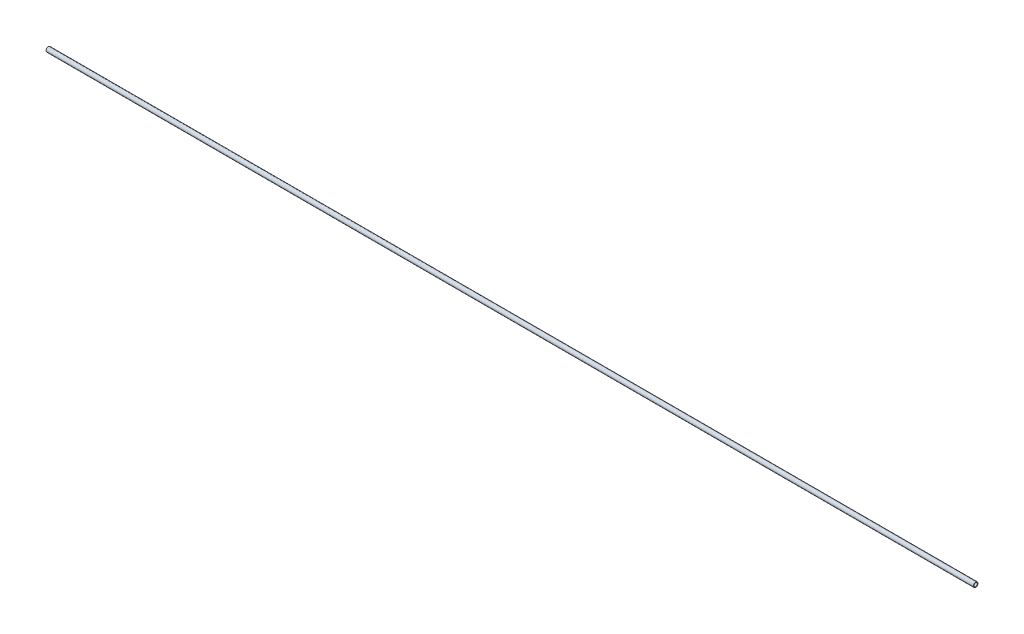
ISO-10303-21;
HEADER;
FILE_DESCRIPTION(('STEP AP214'),'2;1');
FILE_NAME('part.step','',(''),(''),'','','');
FILE_SCHEMA(('AUTOMOTIVE_DESIGN { 1 0 10303 214 1 1 1 1 }'));
ENDSEC;
DATA;
#1=APPLICATION_CONTEXT('core data for automotive mechanical design processes');
#2=APPLICATION_PROTOCOL_DEFINITION('international standard','automotive_design',2000,#1);
#3=PRODUCT_CONTEXT('',#1,'mechanical');
#4=PRODUCT('Part','Part','',(#3));
#5=PRODUCT_RELATED_PRODUCT_CATEGORY('part','',(#4));
#6=PRODUCT_DEFINITION_FORMATION('','',#4);
#7=PRODUCT_DEFINITION_CONTEXT('part definition',#1,'design');
#8=PRODUCT_DEFINITION('design','',#6,#7);
#9=PRODUCT_DEFINITION_SHAPE('','',#8);
#10=(LENGTH_UNIT() NAMED_UNIT(*) SI_UNIT(.MILLI.,.METRE.));
#11=(NAMED_UNIT(*) PLANE_ANGLE_UNIT() SI_UNIT($,.RADIAN.));
#12=(NAMED_UNIT(*) SI_UNIT($,.STERADIAN.) SOLID_ANGLE_UNIT());
#13=UNCERTAINTY_MEASURE_WITH_UNIT(LENGTH_MEASURE(1.E-05),#10,'distance_accuracy_value','');
#14=(GEOMETRIC_REPRESENTATION_CONTEXT(3) GLOBAL_UNCERTAINTY_ASSIGNED_CONTEXT((#13)) GLOBAL_UNIT_ASSIGNED_CONTEXT((#10,
#11,#12)) REPRESENTATION_CONTEXT('',''));
#15=CARTESIAN_POINT('',(0.,0.,0.));
#16=DIRECTION('',(0.,0.,1.));
#17=DIRECTION('',(1.,0.,0.));
#18=AXIS2_PLACEMENT_3D('',#15,#16,#17);
#19=CARTESIAN_POINT('',(5080.,0.,0.));
#20=DIRECTION('',(1.,0.,0.));
#21=DIRECTION('',(0.,0.,-1.));
#22=AXIS2_PLACEMENT_3D('',#19,#20,#21);
#23=PLANE('',#22);
#24=CARTESIAN_POINT('',(5080.,0.,0.));
#25=DIRECTION('',(1.,0.,0.));
#26=DIRECTION('',(0.,0.,-1.));
#27=AXIS2_PLACEMENT_3D('',#24,#25,#26);
#28=CIRCLE('',#27,12.7);
#29=CARTESIAN_POINT('',(5080.,0.,12.7));
#30=VERTEX_POINT('',#29);
#31=EDGE_CURVE('E10',#30,#30,#28,.T.);
#32=ORIENTED_EDGE('',*,*,#31,.T.);
#33=EDGE_LOOP('',(#32));
#34=FACE_BOUND('',#33,.T.);
#35=CARTESIAN_POINT('',(5080.,0.,0.));
#36=DIRECTION('',(1.,0.,0.));
#37=DIRECTION('',(0.,0.,-1.));
#38=AXIS2_PLACEMENT_3D('',#35,#36,#37);
#39=CIRCLE('',#38,9.652);
#40=CARTESIAN_POINT('',(5080.,0.,9.652));
#41=VERTEX_POINT('',#40);
#42=EDGE_CURVE('E45',#41,#41,#39,.T.);
#43=ORIENTED_EDGE('',*,*,#42,.F.);
#44=EDGE_LOOP('',(#43));
#45=FACE_BOUND('',#44,.T.);
#46=ADVANCED_FACE('F34',(#34,#45),#23,.T.);
#47=CARTESIAN_POINT('',(0.,0.,0.));
#48=DIRECTION('',(1.,0.,0.));
#49=DIRECTION('',(0.,0.,-1.));
#50=AXIS2_PLACEMENT_3D('',#47,#48,#49);
#51=PLANE('',#50);
#52=CARTESIAN_POINT('',(0.,0.,0.));
#53=DIRECTION('',(1.,0.,0.));
#54=DIRECTION('',(0.,0.,-1.));
#55=AXIS2_PLACEMENT_3D('',#52,#53,#54);
#56=CIRCLE('',#55,12.7);
#57=CARTESIAN_POINT('',(-8.88178419700125E-13,0.,12.7));
#58=VERTEX_POINT('',#57);
#59=EDGE_CURVE('E38',#58,#58,#56,.T.);
#60=ORIENTED_EDGE('',*,*,#59,.F.);
#61=EDGE_LOOP('',(#60));
#62=FACE_BOUND('',#61,.T.);
#63=CARTESIAN_POINT('',(0.,0.,0.));
#64=DIRECTION('',(1.,0.,0.));
#65=DIRECTION('',(0.,0.,-1.));
#66=AXIS2_PLACEMENT_3D('',#63,#64,#65);
#67=CIRCLE('',#66,9.652);
#68=CARTESIAN_POINT('',(-8.88178419700125E-13,0.,9.652));
#69=VERTEX_POINT('',#68);
#70=EDGE_CURVE('E47',#69,#69,#67,.T.);
#71=ORIENTED_EDGE('',*,*,#70,.T.);
#72=EDGE_LOOP('',(#71));
#73=FACE_BOUND('',#72,.T.);
#74=ADVANCED_FACE('F57',(#62,#73),#51,.F.);
#75=CARTESIAN_POINT('',(5080.,0.,0.));
#76=DIRECTION('',(-1.,0.,0.));
#77=DIRECTION('',(0.,0.,1.));
#78=AXIS2_PLACEMENT_3D('',#75,#76,#77);
#79=CYLINDRICAL_SURFACE('',#78,12.7);
#80=CARTESIAN_POINT('',(5080.,0.,12.7));
#81=CARTESIAN_POINT('',(5027.08333333333,0.,12.7));
#82=CARTESIAN_POINT('',(4974.16666666667,0.,12.7));
#83=CARTESIAN_POINT('',(4868.33333333333,0.,12.7));
#84=CARTESIAN_POINT('',(4815.41666666667,0.,12.7));
#85=CARTESIAN_POINT('',(4709.58333333333,0.,12.7));
#86=CARTESIAN_POINT('',(4656.66666666667,0.,12.7));
#87=CARTESIAN_POINT('',(4550.83333333333,0.,12.7));
#88=CARTESIAN_POINT('',(4497.91666666667,0.,12.7));
#89=CARTESIAN_POINT('',(4392.08333333333,0.,12.7));
#90=CARTESIAN_POINT('',(4339.16666666667,0.,12.7));
#91=CARTESIAN_POINT('',(4233.33333333333,0.,12.7));
#92=CARTESIAN_POINT('',(4180.41666666667,0.,12.7));
#93=CARTESIAN_POINT('',(4074.58333333333,0.,12.7));
#94=CARTESIAN_POINT('',(4021.66666666667,0.,12.7));
#95=CARTESIAN_POINT('',(3915.83333333333,0.,12.7));
#96=CARTESIAN_POINT('',(3862.91666666667,0.,12.7));
#97=CARTESIAN_POINT('',(3757.08333333333,0.,12.7));
#98=CARTESIAN_POINT('',(3704.16666666667,0.,12.7));
#99=CARTESIAN_POINT('',(3598.33333333333,0.,12.7));
#100=CARTESIAN_POINT('',(3545.41666666667,0.,12.7));
#101=CARTESIAN_POINT('',(3439.58333333333,0.,12.7));
#102=CARTESIAN_POINT('',(3386.66666666667,0.,12.7));
#103=CARTESIAN_POINT('',(3280.83333333333,0.,12.7));
#104=CARTESIAN_POINT('',(3227.91666666667,0.,12.7));
#105=CARTESIAN_POINT('',(3122.08333333333,0.,12.7));
#106=CARTESIAN_POINT('',(3069.16666666667,0.,12.7));
#107=CARTESIAN_POINT('',(2963.33333333333,0.,12.7));
#108=CARTESIAN_POINT('',(2910.41666666667,0.,12.7));
#109=CARTESIAN_POINT('',(2804.58333333333,0.,12.7));
#110=CARTESIAN_POINT('',(2751.66666666667,0.,12.7));
#111=CARTESIAN_POINT('',(2645.83333333333,0.,12.7));
#112=CARTESIAN_POINT('',(2592.91666666667,0.,12.7));
#113=CARTESIAN_POINT('',(2487.08333333333,0.,12.7));
#114=CARTESIAN_POINT('',(2434.16666666667,0.,12.7));
#115=CARTESIAN_POINT('',(2328.33333333333,0.,12.7));
#116=CARTESIAN_POINT('',(2275.41666666667,0.,12.7));
#117=CARTESIAN_POINT('',(2169.58333333333,0.,12.7));
#118=CARTESIAN_POINT('',(2116.66666666667,0.,12.7));
#119=CARTESIAN_POINT('',(2010.83333333333,0.,12.7));
#120=CARTESIAN_POINT('',(1957.91666666667,0.,12.7));
#121=CARTESIAN_POINT('',(1852.08333333333,0.,12.7));
#122=CARTESIAN_POINT('',(1799.16666666667,0.,12.7));
#123=CARTESIAN_POINT('',(1693.33333333333,0.,12.7));
#124=CARTESIAN_POINT('',(1640.41666666667,0.,12.7));
#125=CARTESIAN_POINT('',(1534.58333333333,0.,12.7));
#126=CARTESIAN_POINT('',(1481.66666666667,0.,12.7));
#127=CARTESIAN_POINT('',(1375.83333333333,0.,12.7));
#128=CARTESIAN_POINT('',(1322.91666666667,0.,12.7));
#129=CARTESIAN_POINT('',(1217.08333333333,0.,12.7));
#130=CARTESIAN_POINT('',(1164.16666666667,0.,12.7));
#131=CARTESIAN_POINT('',(1058.33333333333,0.,12.7));
#132=CARTESIAN_POINT('',(1005.41666666667,0.,12.7));
#133=CARTESIAN_POINT('',(899.583333333333,0.,12.7));
#134=CARTESIAN_POINT('',(846.666666666666,0.,12.7));
#135=CARTESIAN_POINT('',(740.833333333333,0.,12.7));
#136=CARTESIAN_POINT('',(687.916666666666,0.,12.7));
#137=CARTESIAN_POINT('',(582.083333333332,0.,12.7));
#138=CARTESIAN_POINT('',(529.166666666666,0.,12.7));
#139=CARTESIAN_POINT('',(423.333333333333,0.,12.7));
#140=CARTESIAN_POINT('',(370.416666666666,0.,12.7));
#141=CARTESIAN_POINT('',(264.583333333333,0.,12.7));
#142=CARTESIAN_POINT('',(211.666666666666,0.,12.7));
#143=CARTESIAN_POINT('',(105.833333333333,0.,12.7));
#144=CARTESIAN_POINT('',(52.9166666666659,0.,12.7));
#145=CARTESIAN_POINT('',(-8.88178419700125E-13,0.,12.7));
#146=B_SPLINE_CURVE_WITH_KNOTS('',3,(#80,#81,#82,#83,#84,#85,#86,#87,#88,#89,#90,#91,#92,#93,
#94,#95,#96,#97,#98,#99,#100,#101,#102,#103,#104,#105,#106,#107,#108,#109,#110,#111,#112,#113,
#114,#115,#116,#117,#118,#119,#120,#121,#122,#123,#124,#125,#126,#127,#128,#129,#130,#131,#132,
#133,#134,#135,#136,#137,#138,#139,#140,#141,#142,#143,#144,#145),.UNSPECIFIED.,.F.,.F.,(4,2,2,
2,2,2,2,2,2,2,2,2,2,2,2,2,2,2,2,2,2,2,2,2,2,2,2,2,2,2,2,2,4),(0.,158.75,317.500000000001,476.25,
635.000000000001,793.750000000001,952.500000000001,1111.25,1270.,1428.75,1587.5,1746.25,1905.,
2063.75,2222.5,2381.25,2540.,2698.75,2857.5,3016.25,3175.,3333.75,3492.5,3651.25,3810.,3968.75,
4127.5,4286.25,4445.,4603.75,4762.5,4921.25,5080.),.UNSPECIFIED.);
#147=EDGE_CURVE('BSEAM36',#30,#58,#146,.T.);
#148=ORIENTED_EDGE('',*,*,#31,.F.);
#149=ORIENTED_EDGE('',*,*,#59,.T.);
#150=ORIENTED_EDGE('',*,*,#147,.T.);
#151=ORIENTED_EDGE('',*,*,#147,.F.);
#152=EDGE_LOOP('',(#148,#150,#149,#151));
#153=FACE_BOUND('',#152,.T.);
#154=ADVANCED_FACE('F36',(#153),#79,.T.);
#155=CARTESIAN_POINT('',(5080.,0.,0.));
#156=DIRECTION('',(-1.,0.,0.));
#157=DIRECTION('',(0.,0.,1.));
#158=AXIS2_PLACEMENT_3D('',#155,#156,#157);
#159=CYLINDRICAL_SURFACE('',#158,9.652);
#160=CARTESIAN_POINT('',(5080.,0.,9.652));
#161=CARTESIAN_POINT('',(5027.08333333333,0.,9.652));
#162=CARTESIAN_POINT('',(4974.16666666667,0.,9.652));
#163=CARTESIAN_POINT('',(4868.33333333333,0.,9.652));
#164=CARTESIAN_POINT('',(4815.41666666667,0.,9.652));
#165=CARTESIAN_POINT('',(4709.58333333333,0.,9.652));
#166=CARTESIAN_POINT('',(4656.66666666667,0.,9.652));
#167=CARTESIAN_POINT('',(4550.83333333333,0.,9.652));
#168=CARTESIAN_POINT('',(4497.91666666667,0.,9.652));
#169=CARTESIAN_POINT('',(4392.08333333333,0.,9.652));
#170=CARTESIAN_POINT('',(4339.16666666667,0.,9.652));
#171=CARTESIAN_POINT('',(4233.33333333333,0.,9.652));
#172=CARTESIAN_POINT('',(4180.41666666667,0.,9.652));
#173=CARTESIAN_POINT('',(4074.58333333333,0.,9.652));
#174=CARTESIAN_POINT('',(4021.66666666667,0.,9.652));
#175=CARTESIAN_POINT('',(3915.83333333333,0.,9.652));
#176=CARTESIAN_POINT('',(3862.91666666667,0.,9.652));
#177=CARTESIAN_POINT('',(3757.08333333333,0.,9.652));
#178=CARTESIAN_POINT('',(3704.16666666667,0.,9.652));
#179=CARTESIAN_POINT('',(3598.33333333333,0.,9.652));
#180=CARTESIAN_POINT('',(3545.41666666667,0.,9.652));
#181=CARTESIAN_POINT('',(3439.58333333333,0.,9.652));
#182=CARTESIAN_POINT('',(3386.66666666667,0.,9.652));
#183=CARTESIAN_POINT('',(3280.83333333333,0.,9.652));
#184=CARTESIAN_POINT('',(3227.91666666667,0.,9.652));
#185=CARTESIAN_POINT('',(3122.08333333333,0.,9.652));
#186=CARTESIAN_POINT('',(3069.16666666667,0.,9.652));
#187=CARTESIAN_POINT('',(2963.33333333333,0.,9.652));
#188=CARTESIAN_POINT('',(2910.41666666667,0.,9.652));
#189=CARTESIAN_POINT('',(2804.58333333333,0.,9.652));
#190=CARTESIAN_POINT('',(2751.66666666667,0.,9.652));
#191=CARTESIAN_POINT('',(2645.83333333333,0.,9.652));
#192=CARTESIAN_POINT('',(2592.91666666667,0.,9.652));
#193=CARTESIAN_POINT('',(2487.08333333333,0.,9.652));
#194=CARTESIAN_POINT('',(2434.16666666667,0.,9.652));
#195=CARTESIAN_POINT('',(2328.33333333333,0.,9.652));
#196=CARTESIAN_POINT('',(2275.41666666667,0.,9.652));
#197=CARTESIAN_POINT('',(2169.58333333333,0.,9.652));
#198=CARTESIAN_POINT('',(2116.66666666667,0.,9.652));
#199=CARTESIAN_POINT('',(2010.83333333333,0.,9.652));
#200=CARTESIAN_POINT('',(1957.91666666667,0.,9.652));
#201=CARTESIAN_POINT('',(1852.08333333333,0.,9.652));
#202=CARTESIAN_POINT('',(1799.16666666667,0.,9.652));
#203=CARTESIAN_POINT('',(1693.33333333333,0.,9.652));
#204=CARTESIAN_POINT('',(1640.41666666667,0.,9.652));
#205=CARTESIAN_POINT('',(1534.58333333333,0.,9.652));
#206=CARTESIAN_POINT('',(1481.66666666667,0.,9.652));
#207=CARTESIAN_POINT('',(1375.83333333333,0.,9.652));
#208=CARTESIAN_POINT('',(1322.91666666667,0.,9.652));
#209=CARTESIAN_POINT('',(1217.08333333333,0.,9.652));
#210=CARTESIAN_POINT('',(1164.16666666667,0.,9.652));
#211=CARTESIAN_POINT('',(1058.33333333333,0.,9.652));
#212=CARTESIAN_POINT('',(1005.41666666667,0.,9.652));
#213=CARTESIAN_POINT('',(899.583333333333,0.,9.652));
#214=CARTESIAN_POINT('',(846.666666666666,0.,9.652));
#215=CARTESIAN_POINT('',(740.833333333332,0.,9.652));
#216=CARTESIAN_POINT('',(687.916666666666,0.,9.652));
#217=CARTESIAN_POINT('',(582.083333333332,0.,9.652));
#218=CARTESIAN_POINT('',(529.166666666666,0.,9.652));
#219=CARTESIAN_POINT('',(423.333333333333,0.,9.652));
#220=CARTESIAN_POINT('',(370.416666666666,0.,9.652));
#221=CARTESIAN_POINT('',(264.583333333333,0.,9.652));
#222=CARTESIAN_POINT('',(211.666666666666,0.,9.652));
#223=CARTESIAN_POINT('',(105.833333333333,0.,9.652));
#224=CARTESIAN_POINT('',(52.9166666666659,0.,9.652));
#225=CARTESIAN_POINT('',(-8.88178419700125E-13,0.,9.652));
#226=B_SPLINE_CURVE_WITH_KNOTS('',3,(#160,#161,#162,#163,#164,#165,#166,#167,#168,#169,#170,
#171,#172,#173,#174,#175,#176,#177,#178,#179,#180,#181,#182,#183,#184,#185,#186,#187,#188,#189,
#190,#191,#192,#193,#194,#195,#196,#197,#198,#199,#200,#201,#202,#203,#204,#205,#206,#207,#208,
#209,#210,#211,#212,#213,#214,#215,#216,#217,#218,#219,#220,#221,#222,#223,#224,#225),
.UNSPECIFIED.,.F.,.F.,(4,2,2,2,2,2,2,2,2,2,2,2,2,2,2,2,2,2,2,2,2,2,2,2,2,2,2,2,2,2,2,2,4),(0.,
158.749999999999,317.5,476.249999999999,635.,793.749999999999,952.5,1111.25,1270.,1428.75,
1587.5,1746.25,1905.,2063.75,2222.5,2381.25,2540.,2698.75,2857.5,3016.25,3175.,3333.75,3492.5,
3651.25,3810.,3968.75,4127.5,4286.25,4445.,4603.75,4762.5,4921.25,5080.),.UNSPECIFIED.);
#227=EDGE_CURVE('BSEAM53',#41,#69,#226,.T.);
#228=ORIENTED_EDGE('',*,*,#42,.T.);
#229=ORIENTED_EDGE('',*,*,#70,.F.);
#230=ORIENTED_EDGE('',*,*,#227,.T.);
#231=ORIENTED_EDGE('',*,*,#227,.F.);
#232=EDGE_LOOP('',(#228,#230,#229,#231));
#233=FACE_BOUND('',#232,.T.);
#234=ADVANCED_FACE('F53',(#233),#159,.F.);
#235=CLOSED_SHELL('',(#46,#74,#154,#234));
#236=MANIFOLD_SOLID_BREP('B2',#235);
#237=ADVANCED_BREP_SHAPE_REPRESENTATION('',(#18,#236),#14);
#238=SHAPE_DEFINITION_REPRESENTATION(#9,#237);
ENDSEC;
END-ISO-10303-21;
